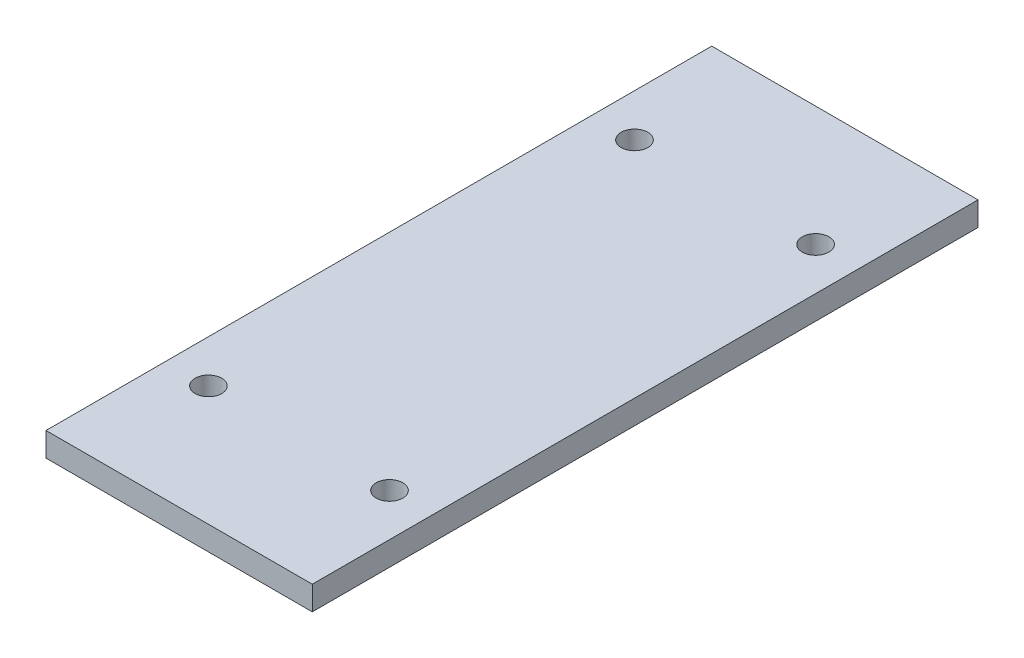
ISO-10303-21;
HEADER;
FILE_DESCRIPTION(('STEP AP214'),'2;1');
FILE_NAME('part.step','',(''),(''),'','','');
FILE_SCHEMA(('AUTOMOTIVE_DESIGN { 1 0 10303 214 1 1 1 1 }'));
ENDSEC;
DATA;
#1=APPLICATION_CONTEXT('core data for automotive mechanical design processes');
#2=APPLICATION_PROTOCOL_DEFINITION('international standard','automotive_design',2000,#1);
#3=PRODUCT_CONTEXT('',#1,'mechanical');
#4=PRODUCT('Part','Part','',(#3));
#5=PRODUCT_RELATED_PRODUCT_CATEGORY('part','',(#4));
#6=PRODUCT_DEFINITION_FORMATION('','',#4);
#7=PRODUCT_DEFINITION_CONTEXT('part definition',#1,'design');
#8=PRODUCT_DEFINITION('design','',#6,#7);
#9=PRODUCT_DEFINITION_SHAPE('','',#8);
#10=(LENGTH_UNIT() NAMED_UNIT(*) SI_UNIT(.MILLI.,.METRE.));
#11=(NAMED_UNIT(*) PLANE_ANGLE_UNIT() SI_UNIT($,.RADIAN.));
#12=(NAMED_UNIT(*) SI_UNIT($,.STERADIAN.) SOLID_ANGLE_UNIT());
#13=UNCERTAINTY_MEASURE_WITH_UNIT(LENGTH_MEASURE(1.E-05),#10,'distance_accuracy_value','');
#14=(GEOMETRIC_REPRESENTATION_CONTEXT(3) GLOBAL_UNCERTAINTY_ASSIGNED_CONTEXT((#13)) GLOBAL_UNIT_ASSIGNED_CONTEXT((#10,
#11,#12)) REPRESENTATION_CONTEXT('',''));
#15=CARTESIAN_POINT('',(0.,0.,0.));
#16=DIRECTION('',(0.,0.,1.));
#17=DIRECTION('',(1.,0.,0.));
#18=AXIS2_PLACEMENT_3D('',#15,#16,#17);
#19=CARTESIAN_POINT('',(0.,0.,250.));
#20=DIRECTION('',(1.,0.,0.));
#21=DIRECTION('',(0.,0.,-1.));
#22=AXIS2_PLACEMENT_3D('',#19,#20,#21);
#23=PLANE('',#22);
#24=DIRECTION('',(0.,-1.,0.));
#25=VECTOR('',#24,1.);
#26=CARTESIAN_POINT('',(0.,0.,0.));
#27=LINE('',#26,#25);
#28=CARTESIAN_POINT('',(0.,0.,0.));
#29=VERTEX_POINT('',#28);
#30=CARTESIAN_POINT('',(0.,-9.,0.));
#31=VERTEX_POINT('',#30);
#32=EDGE_CURVE('E96',#29,#31,#27,.T.);
#33=ORIENTED_EDGE('',*,*,#32,.T.);
#34=DIRECTION('',(0.,0.,-1.));
#35=VECTOR('',#34,1.);
#36=CARTESIAN_POINT('',(0.,-9.,250.));
#37=LINE('',#36,#35);
#38=CARTESIAN_POINT('',(0.,-9.,250.));
#39=VERTEX_POINT('',#38);
#40=EDGE_CURVE('E11',#39,#31,#37,.T.);
#41=ORIENTED_EDGE('',*,*,#40,.F.);
#42=DIRECTION('',(0.,-1.,0.));
#43=VECTOR('',#42,1.);
#44=CARTESIAN_POINT('',(0.,0.,250.));
#45=LINE('',#44,#43);
#46=CARTESIAN_POINT('',(0.,0.,250.));
#47=VERTEX_POINT('',#46);
#48=EDGE_CURVE('E82',#47,#39,#45,.T.);
#49=ORIENTED_EDGE('',*,*,#48,.F.);
#50=DIRECTION('',(0.,0.,-1.));
#51=VECTOR('',#50,1.);
#52=CARTESIAN_POINT('',(0.,0.,250.));
#53=LINE('',#52,#51);
#54=EDGE_CURVE('E49',#47,#29,#53,.T.);
#55=ORIENTED_EDGE('',*,*,#54,.T.);
#56=EDGE_LOOP('',(#33,#41,#49,#55));
#57=FACE_BOUND('',#56,.T.);
#58=ADVANCED_FACE('F33',(#57),#23,.F.);
#59=CARTESIAN_POINT('',(0.,-9.,250.));
#60=DIRECTION('',(0.,1.,0.));
#61=DIRECTION('',(0.,0.,1.));
#62=AXIS2_PLACEMENT_3D('',#59,#60,#61);
#63=PLANE('',#62);
#64=CARTESIAN_POINT('',(84.,-9.,45.));
#65=DIRECTION('',(0.,1.,0.));
#66=DIRECTION('',(0.,0.,1.));
#67=AXIS2_PLACEMENT_3D('',#64,#65,#66);
#68=CIRCLE('',#67,5.00000000000001);
#69=CARTESIAN_POINT('',(84.,-9.,50.));
#70=VERTEX_POINT('',#69);
#71=EDGE_CURVE('E111',#70,#70,#68,.T.);
#72=ORIENTED_EDGE('',*,*,#71,.T.);
#73=EDGE_LOOP('',(#72));
#74=FACE_BOUND('',#73,.T.);
#75=CARTESIAN_POINT('',(16.,-9.,205.));
#76=DIRECTION('',(0.,1.,0.));
#77=DIRECTION('',(0.,0.,1.));
#78=AXIS2_PLACEMENT_3D('',#75,#76,#77);
#79=CIRCLE('',#78,5.);
#80=CARTESIAN_POINT('',(16.,-9.,210.));
#81=VERTEX_POINT('',#80);
#82=EDGE_CURVE('E117',#81,#81,#79,.T.);
#83=ORIENTED_EDGE('',*,*,#82,.T.);
#84=EDGE_LOOP('',(#83));
#85=FACE_BOUND('',#84,.T.);
#86=CARTESIAN_POINT('',(84.,-9.,205.));
#87=DIRECTION('',(0.,1.,0.));
#88=DIRECTION('',(0.,0.,1.));
#89=AXIS2_PLACEMENT_3D('',#86,#87,#88);
#90=CIRCLE('',#89,5.00000000000001);
#91=CARTESIAN_POINT('',(84.,-9.,210.));
#92=VERTEX_POINT('',#91);
#93=EDGE_CURVE('E118',#92,#92,#90,.T.);
#94=ORIENTED_EDGE('',*,*,#93,.T.);
#95=EDGE_LOOP('',(#94));
#96=FACE_BOUND('',#95,.T.);
#97=CARTESIAN_POINT('',(16.,-9.,45.));
#98=DIRECTION('',(0.,1.,0.));
#99=DIRECTION('',(0.,0.,1.));
#100=AXIS2_PLACEMENT_3D('',#97,#98,#99);
#101=CIRCLE('',#100,5.);
#102=CARTESIAN_POINT('',(16.,-9.,50.));
#103=VERTEX_POINT('',#102);
#104=EDGE_CURVE('E98',#103,#103,#101,.T.);
#105=ORIENTED_EDGE('',*,*,#104,.T.);
#106=EDGE_LOOP('',(#105));
#107=FACE_BOUND('',#106,.T.);
#108=DIRECTION('',(1.,0.,0.));
#109=VECTOR('',#108,1.);
#110=CARTESIAN_POINT('',(0.,-9.,0.));
#111=LINE('',#110,#109);
#112=CARTESIAN_POINT('',(100.,-9.,0.));
#113=VERTEX_POINT('',#112);
#114=EDGE_CURVE('E87',#31,#113,#111,.T.);
#115=ORIENTED_EDGE('',*,*,#114,.T.);
#116=DIRECTION('',(0.,0.,-1.));
#117=VECTOR('',#116,1.);
#118=CARTESIAN_POINT('',(100.,-9.,250.));
#119=LINE('',#118,#117);
#120=CARTESIAN_POINT('',(100.,-9.,250.));
#121=VERTEX_POINT('',#120);
#122=EDGE_CURVE('E41',#121,#113,#119,.T.);
#123=ORIENTED_EDGE('',*,*,#122,.F.);
#124=DIRECTION('',(1.,0.,0.));
#125=VECTOR('',#124,1.);
#126=CARTESIAN_POINT('',(0.,-9.,250.));
#127=LINE('',#126,#125);
#128=EDGE_CURVE('E74',#39,#121,#127,.T.);
#129=ORIENTED_EDGE('',*,*,#128,.F.);
#130=ORIENTED_EDGE('',*,*,#40,.T.);
#131=EDGE_LOOP('',(#115,#123,#129,#130));
#132=FACE_BOUND('',#131,.T.);
#133=ADVANCED_FACE('F86',(#74,#85,#96,#107,#132),#63,.F.);
#134=CARTESIAN_POINT('',(100.,0.,250.));
#135=DIRECTION('',(1.,0.,0.));
#136=DIRECTION('',(0.,0.,-1.));
#137=AXIS2_PLACEMENT_3D('',#134,#135,#136);
#138=PLANE('',#137);
#139=DIRECTION('',(0.,-1.,0.));
#140=VECTOR('',#139,1.);
#141=CARTESIAN_POINT('',(100.,0.,0.));
#142=LINE('',#141,#140);
#143=CARTESIAN_POINT('',(100.,0.,0.));
#144=VERTEX_POINT('',#143);
#145=EDGE_CURVE('E100',#144,#113,#142,.T.);
#146=ORIENTED_EDGE('',*,*,#145,.F.);
#147=DIRECTION('',(0.,0.,-1.));
#148=VECTOR('',#147,1.);
#149=CARTESIAN_POINT('',(100.,0.,250.));
#150=LINE('',#149,#148);
#151=CARTESIAN_POINT('',(100.,0.,250.));
#152=VERTEX_POINT('',#151);
#153=EDGE_CURVE('E63',#152,#144,#150,.T.);
#154=ORIENTED_EDGE('',*,*,#153,.F.);
#155=DIRECTION('',(0.,-1.,0.));
#156=VECTOR('',#155,1.);
#157=CARTESIAN_POINT('',(100.,0.,250.));
#158=LINE('',#157,#156);
#159=EDGE_CURVE('E81',#152,#121,#158,.T.);
#160=ORIENTED_EDGE('',*,*,#159,.T.);
#161=ORIENTED_EDGE('',*,*,#122,.T.);
#162=EDGE_LOOP('',(#146,#154,#160,#161));
#163=FACE_BOUND('',#162,.T.);
#164=ADVANCED_FACE('F90',(#163),#138,.T.);
#165=CARTESIAN_POINT('',(0.,0.,250.));
#166=DIRECTION('',(0.,1.,0.));
#167=DIRECTION('',(0.,0.,1.));
#168=AXIS2_PLACEMENT_3D('',#165,#166,#167);
#169=PLANE('',#168);
#170=CARTESIAN_POINT('',(84.,0.,45.));
#171=DIRECTION('',(0.,1.,0.));
#172=DIRECTION('',(0.,0.,1.));
#173=AXIS2_PLACEMENT_3D('',#170,#171,#172);
#174=CIRCLE('',#173,5.00000000000001);
#175=CARTESIAN_POINT('',(84.,0.,50.));
#176=VERTEX_POINT('',#175);
#177=EDGE_CURVE('E121',#176,#176,#174,.T.);
#178=ORIENTED_EDGE('',*,*,#177,.F.);
#179=EDGE_LOOP('',(#178));
#180=FACE_BOUND('',#179,.T.);
#181=CARTESIAN_POINT('',(16.,0.,205.));
#182=DIRECTION('',(0.,1.,0.));
#183=DIRECTION('',(0.,0.,1.));
#184=AXIS2_PLACEMENT_3D('',#181,#182,#183);
#185=CIRCLE('',#184,5.);
#186=CARTESIAN_POINT('',(16.,0.,210.));
#187=VERTEX_POINT('',#186);
#188=EDGE_CURVE('E114',#187,#187,#185,.T.);
#189=ORIENTED_EDGE('',*,*,#188,.F.);
#190=EDGE_LOOP('',(#189));
#191=FACE_BOUND('',#190,.T.);
#192=CARTESIAN_POINT('',(84.,0.,205.));
#193=DIRECTION('',(0.,1.,0.));
#194=DIRECTION('',(0.,0.,1.));
#195=AXIS2_PLACEMENT_3D('',#192,#193,#194);
#196=CIRCLE('',#195,5.00000000000001);
#197=CARTESIAN_POINT('',(84.,0.,210.));
#198=VERTEX_POINT('',#197);
#199=EDGE_CURVE('E126',#198,#198,#196,.T.);
#200=ORIENTED_EDGE('',*,*,#199,.F.);
#201=EDGE_LOOP('',(#200));
#202=FACE_BOUND('',#201,.T.);
#203=CARTESIAN_POINT('',(16.,0.,45.));
#204=DIRECTION('',(0.,1.,0.));
#205=DIRECTION('',(0.,0.,1.));
#206=AXIS2_PLACEMENT_3D('',#203,#204,#205);
#207=CIRCLE('',#206,5.);
#208=CARTESIAN_POINT('',(16.,0.,50.));
#209=VERTEX_POINT('',#208);
#210=EDGE_CURVE('E108',#209,#209,#207,.T.);
#211=ORIENTED_EDGE('',*,*,#210,.F.);
#212=EDGE_LOOP('',(#211));
#213=FACE_BOUND('',#212,.T.);
#214=DIRECTION('',(1.,0.,0.));
#215=VECTOR('',#214,1.);
#216=CARTESIAN_POINT('',(0.,0.,0.));
#217=LINE('',#216,#215);
#218=EDGE_CURVE('E102',#29,#144,#217,.T.);
#219=ORIENTED_EDGE('',*,*,#218,.F.);
#220=ORIENTED_EDGE('',*,*,#54,.F.);
#221=DIRECTION('',(1.,0.,0.));
#222=VECTOR('',#221,1.);
#223=CARTESIAN_POINT('',(0.,0.,250.));
#224=LINE('',#223,#222);
#225=EDGE_CURVE('E91',#47,#152,#224,.T.);
#226=ORIENTED_EDGE('',*,*,#225,.T.);
#227=ORIENTED_EDGE('',*,*,#153,.T.);
#228=EDGE_LOOP('',(#219,#220,#226,#227));
#229=FACE_BOUND('',#228,.T.);
#230=ADVANCED_FACE('F142',(#180,#191,#202,#213,#229),#169,.T.);
#231=CARTESIAN_POINT('',(0.,0.,250.));
#232=DIRECTION('',(0.,0.,1.));
#233=DIRECTION('',(1.,0.,0.));
#234=AXIS2_PLACEMENT_3D('',#231,#232,#233);
#235=PLANE('',#234);
#236=ORIENTED_EDGE('',*,*,#48,.T.);
#237=ORIENTED_EDGE('',*,*,#128,.T.);
#238=ORIENTED_EDGE('',*,*,#159,.F.);
#239=ORIENTED_EDGE('',*,*,#225,.F.);
#240=EDGE_LOOP('',(#236,#237,#238,#239));
#241=FACE_BOUND('',#240,.T.);
#242=ADVANCED_FACE('F78',(#241),#235,.T.);
#243=CARTESIAN_POINT('',(0.,0.,0.));
#244=DIRECTION('',(0.,0.,1.));
#245=DIRECTION('',(1.,0.,0.));
#246=AXIS2_PLACEMENT_3D('',#243,#244,#245);
#247=PLANE('',#246);
#248=ORIENTED_EDGE('',*,*,#32,.F.);
#249=ORIENTED_EDGE('',*,*,#218,.T.);
#250=ORIENTED_EDGE('',*,*,#145,.T.);
#251=ORIENTED_EDGE('',*,*,#114,.F.);
#252=EDGE_LOOP('',(#248,#249,#250,#251));
#253=FACE_BOUND('',#252,.T.);
#254=ADVANCED_FACE('F150',(#253),#247,.F.);
#255=CARTESIAN_POINT('',(16.,-9.,45.));
#256=DIRECTION('',(0.,1.,0.));
#257=DIRECTION('',(0.,0.,1.));
#258=AXIS2_PLACEMENT_3D('',#255,#256,#257);
#259=CYLINDRICAL_SURFACE('',#258,5.);
#260=ORIENTED_EDGE('',*,*,#104,.F.);
#261=EDGE_LOOP('',(#260));
#262=FACE_BOUND('',#261,.T.);
#263=ORIENTED_EDGE('',*,*,#210,.T.);
#264=EDGE_LOOP('',(#263));
#265=FACE_BOUND('',#264,.T.);
#266=ADVANCED_FACE('F138',(#262,#265),#259,.F.);
#267=CARTESIAN_POINT('',(84.,-9.,205.));
#268=DIRECTION('',(0.,1.,0.));
#269=DIRECTION('',(0.,0.,1.));
#270=AXIS2_PLACEMENT_3D('',#267,#268,#269);
#271=CYLINDRICAL_SURFACE('',#270,5.00000000000001);
#272=ORIENTED_EDGE('',*,*,#93,.F.);
#273=EDGE_LOOP('',(#272));
#274=FACE_BOUND('',#273,.T.);
#275=ORIENTED_EDGE('',*,*,#199,.T.);
#276=EDGE_LOOP('',(#275));
#277=FACE_BOUND('',#276,.T.);
#278=ADVANCED_FACE('F134',(#274,#277),#271,.F.);
#279=CARTESIAN_POINT('',(16.,-9.,205.));
#280=DIRECTION('',(0.,1.,0.));
#281=DIRECTION('',(0.,0.,1.));
#282=AXIS2_PLACEMENT_3D('',#279,#280,#281);
#283=CYLINDRICAL_SURFACE('',#282,5.);
#284=ORIENTED_EDGE('',*,*,#82,.F.);
#285=EDGE_LOOP('',(#284));
#286=FACE_BOUND('',#285,.T.);
#287=ORIENTED_EDGE('',*,*,#188,.T.);
#288=EDGE_LOOP('',(#287));
#289=FACE_BOUND('',#288,.T.);
#290=ADVANCED_FACE('F137',(#286,#289),#283,.F.);
#291=CARTESIAN_POINT('',(84.,-9.,45.));
#292=DIRECTION('',(0.,1.,0.));
#293=DIRECTION('',(0.,0.,1.));
#294=AXIS2_PLACEMENT_3D('',#291,#292,#293);
#295=CYLINDRICAL_SURFACE('',#294,5.00000000000001);
#296=ORIENTED_EDGE('',*,*,#71,.F.);
#297=EDGE_LOOP('',(#296));
#298=FACE_BOUND('',#297,.T.);
#299=ORIENTED_EDGE('',*,*,#177,.T.);
#300=EDGE_LOOP('',(#299));
#301=FACE_BOUND('',#300,.T.);
#302=ADVANCED_FACE('F209',(#298,#301),#295,.F.);
#303=CLOSED_SHELL('',(#58,#133,#164,#230,#242,#254,#266,#278,#290,#302));
#304=MANIFOLD_SOLID_BREP('B2',#303);
#305=ADVANCED_BREP_SHAPE_REPRESENTATION('',(#18,#304),#14);
#306=SHAPE_DEFINITION_REPRESENTATION(#9,#305);
ENDSEC;
END-ISO-10303-21;
